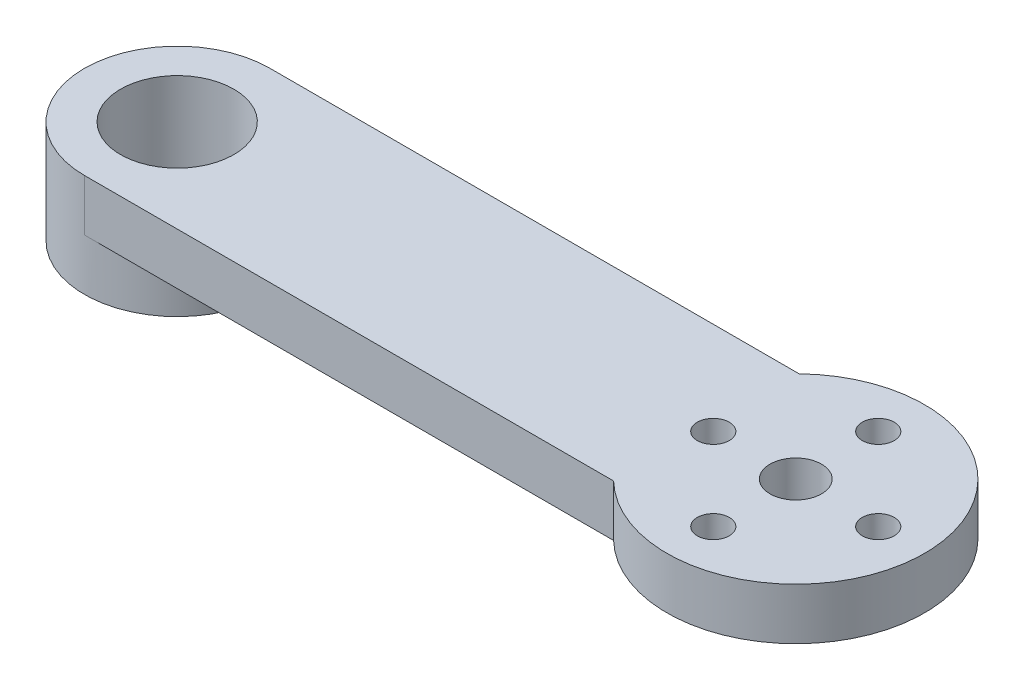
ISO-10303-21;
HEADER;
FILE_DESCRIPTION(('STEP AP214'),'2;1');
FILE_NAME('part.step','',(''),(''),'','','');
FILE_SCHEMA(('AUTOMOTIVE_DESIGN { 1 0 10303 214 1 1 1 1 }'));
ENDSEC;
DATA;
#1=APPLICATION_CONTEXT('core data for automotive mechanical design processes');
#2=APPLICATION_PROTOCOL_DEFINITION('international standard','automotive_design',2000,#1);
#3=PRODUCT_CONTEXT('',#1,'mechanical');
#4=PRODUCT('Part','Part','',(#3));
#5=PRODUCT_RELATED_PRODUCT_CATEGORY('part','',(#4));
#6=PRODUCT_DEFINITION_FORMATION('','',#4);
#7=PRODUCT_DEFINITION_CONTEXT('part definition',#1,'design');
#8=PRODUCT_DEFINITION('design','',#6,#7);
#9=PRODUCT_DEFINITION_SHAPE('','',#8);
#10=(LENGTH_UNIT() NAMED_UNIT(*) SI_UNIT(.MILLI.,.METRE.));
#11=(NAMED_UNIT(*) PLANE_ANGLE_UNIT() SI_UNIT($,.RADIAN.));
#12=(NAMED_UNIT(*) SI_UNIT($,.STERADIAN.) SOLID_ANGLE_UNIT());
#13=UNCERTAINTY_MEASURE_WITH_UNIT(LENGTH_MEASURE(1.E-05),#10,'distance_accuracy_value','');
#14=(GEOMETRIC_REPRESENTATION_CONTEXT(3) GLOBAL_UNCERTAINTY_ASSIGNED_CONTEXT((#13)) GLOBAL_UNIT_ASSIGNED_CONTEXT((#10,
#11,#12)) REPRESENTATION_CONTEXT('',''));
#15=CARTESIAN_POINT('',(0.,0.,0.));
#16=DIRECTION('',(0.,0.,1.));
#17=DIRECTION('',(1.,0.,0.));
#18=AXIS2_PLACEMENT_3D('',#15,#16,#17);
#19=CARTESIAN_POINT('',(60.,0.,0.));
#20=DIRECTION('',(0.,1.,0.));
#21=DIRECTION('',(0.,0.,1.));
#22=AXIS2_PLACEMENT_3D('',#19,#20,#21);
#23=PLANE('',#22);
#24=CARTESIAN_POINT('',(60.,0.,8.));
#25=DIRECTION('',(0.,-1.,0.));
#26=DIRECTION('',(0.,0.,-1.));
#27=AXIS2_PLACEMENT_3D('',#24,#25,#26);
#28=CIRCLE('',#27,1.55);
#29=CARTESIAN_POINT('',(60.,0.,6.45));
#30=VERTEX_POINT('',#29);
#31=EDGE_CURVE('E174',#30,#30,#28,.T.);
#32=ORIENTED_EDGE('',*,*,#31,.F.);
#33=EDGE_LOOP('',(#32));
#34=FACE_BOUND('',#33,.T.);
#35=CARTESIAN_POINT('',(60.,0.,-8.));
#36=DIRECTION('',(0.,-1.,0.));
#37=DIRECTION('',(0.,0.,-1.));
#38=AXIS2_PLACEMENT_3D('',#35,#36,#37);
#39=CIRCLE('',#38,1.55);
#40=CARTESIAN_POINT('',(60.,0.,-9.55));
#41=VERTEX_POINT('',#40);
#42=EDGE_CURVE('E170',#41,#41,#39,.T.);
#43=ORIENTED_EDGE('',*,*,#42,.F.);
#44=EDGE_LOOP('',(#43));
#45=FACE_BOUND('',#44,.T.);
#46=CARTESIAN_POINT('',(68.,0.,0.));
#47=DIRECTION('',(0.,-1.,0.));
#48=DIRECTION('',(0.,0.,-1.));
#49=AXIS2_PLACEMENT_3D('',#46,#47,#48);
#50=CIRCLE('',#49,1.54999999999999);
#51=CARTESIAN_POINT('',(68.,0.,-1.54999999999999));
#52=VERTEX_POINT('',#51);
#53=EDGE_CURVE('E162',#52,#52,#50,.T.);
#54=ORIENTED_EDGE('',*,*,#53,.F.);
#55=EDGE_LOOP('',(#54));
#56=FACE_BOUND('',#55,.T.);
#57=CARTESIAN_POINT('',(52.,0.,0.));
#58=DIRECTION('',(0.,-1.,0.));
#59=DIRECTION('',(0.,0.,-1.));
#60=AXIS2_PLACEMENT_3D('',#57,#58,#59);
#61=CIRCLE('',#60,1.55);
#62=CARTESIAN_POINT('',(52.,0.,-1.55));
#63=VERTEX_POINT('',#62);
#64=EDGE_CURVE('E154',#63,#63,#61,.T.);
#65=ORIENTED_EDGE('',*,*,#64,.F.);
#66=EDGE_LOOP('',(#65));
#67=FACE_BOUND('',#66,.T.);
#68=CARTESIAN_POINT('',(60.,0.,0.));
#69=DIRECTION('',(0.,1.,0.));
#70=DIRECTION('',(0.,0.,1.));
#71=AXIS2_PLACEMENT_3D('',#68,#69,#70);
#72=CIRCLE('',#71,2.50000000000002);
#73=CARTESIAN_POINT('',(60.,0.,2.50000000000002));
#74=VERTEX_POINT('',#73);
#75=EDGE_CURVE('E123',#74,#74,#72,.T.);
#76=ORIENTED_EDGE('',*,*,#75,.T.);
#77=EDGE_LOOP('',(#76));
#78=FACE_BOUND('',#77,.T.);
#79=CARTESIAN_POINT('',(0.,0.,0.));
#80=DIRECTION('',(0.,-1.,0.));
#81=DIRECTION('',(0.,0.,-1.));
#82=AXIS2_PLACEMENT_3D('',#79,#80,#81);
#83=CIRCLE('',#82,9.);
#84=CARTESIAN_POINT('',(0.,0.,-9.));
#85=VERTEX_POINT('',#84);
#86=CARTESIAN_POINT('',(0.,0.,9.));
#87=VERTEX_POINT('',#86);
#88=EDGE_CURVE('E77',#85,#87,#83,.T.);
#89=ORIENTED_EDGE('',*,*,#88,.F.);
#90=DIRECTION('',(-1.,0.,0.));
#91=VECTOR('',#90,1.);
#92=CARTESIAN_POINT('',(0.,0.,-9.));
#93=LINE('',#92,#91);
#94=CARTESIAN_POINT('',(51.3253242135513,0.,-9.));
#95=VERTEX_POINT('',#94);
#96=EDGE_CURVE('E95',#95,#85,#93,.T.);
#97=ORIENTED_EDGE('',*,*,#96,.F.);
#98=CARTESIAN_POINT('',(60.,0.,0.));
#99=DIRECTION('',(0.,1.,0.));
#100=DIRECTION('',(0.,0.,1.));
#101=AXIS2_PLACEMENT_3D('',#98,#99,#100);
#102=CIRCLE('',#101,12.5);
#103=CARTESIAN_POINT('',(51.3253242135513,0.,9.));
#104=VERTEX_POINT('',#103);
#105=EDGE_CURVE('E105',#104,#95,#102,.T.);
#106=ORIENTED_EDGE('',*,*,#105,.F.);
#107=DIRECTION('',(1.,0.,0.));
#108=VECTOR('',#107,1.);
#109=CARTESIAN_POINT('',(0.,0.,9.));
#110=LINE('',#109,#108);
#111=EDGE_CURVE('E83',#87,#104,#110,.T.);
#112=ORIENTED_EDGE('',*,*,#111,.F.);
#113=EDGE_LOOP('',(#89,#97,#106,#112));
#114=FACE_BOUND('',#113,.T.);
#115=ADVANCED_FACE('F44',(#34,#45,#56,#67,#78,#114),#23,.F.);
#116=CARTESIAN_POINT('',(60.,5.,0.));
#117=DIRECTION('',(0.,-1.,0.));
#118=DIRECTION('',(0.,0.,-1.));
#119=AXIS2_PLACEMENT_3D('',#116,#117,#118);
#120=CYLINDRICAL_SURFACE('',#119,12.5);
#121=ORIENTED_EDGE('',*,*,#105,.T.);
#122=DIRECTION('',(0.,-1.,0.));
#123=VECTOR('',#122,1.);
#124=CARTESIAN_POINT('',(51.3253242135513,5.,-9.));
#125=LINE('',#124,#123);
#126=CARTESIAN_POINT('',(51.3253242135513,5.,-9.));
#127=VERTEX_POINT('',#126);
#128=EDGE_CURVE('E11',#127,#95,#125,.T.);
#129=ORIENTED_EDGE('',*,*,#128,.F.);
#130=CARTESIAN_POINT('',(60.,5.,0.));
#131=DIRECTION('',(0.,1.,0.));
#132=DIRECTION('',(0.,0.,1.));
#133=AXIS2_PLACEMENT_3D('',#130,#131,#132);
#134=CIRCLE('',#133,12.5);
#135=CARTESIAN_POINT('',(51.3253242135513,5.,9.));
#136=VERTEX_POINT('',#135);
#137=EDGE_CURVE('E119',#136,#127,#134,.T.);
#138=ORIENTED_EDGE('',*,*,#137,.F.);
#139=DIRECTION('',(0.,-1.,0.));
#140=VECTOR('',#139,1.);
#141=CARTESIAN_POINT('',(51.3253242135513,5.,9.));
#142=LINE('',#141,#140);
#143=EDGE_CURVE('E113',#136,#104,#142,.T.);
#144=ORIENTED_EDGE('',*,*,#143,.T.);
#145=EDGE_LOOP('',(#121,#129,#138,#144));
#146=FACE_BOUND('',#145,.T.);
#147=ADVANCED_FACE('F46',(#146),#120,.T.);
#148=CARTESIAN_POINT('',(0.,5.,-9.));
#149=DIRECTION('',(0.,0.,1.));
#150=DIRECTION('',(1.,0.,0.));
#151=AXIS2_PLACEMENT_3D('',#148,#149,#150);
#152=PLANE('',#151);
#153=ORIENTED_EDGE('',*,*,#96,.T.);
#154=DIRECTION('',(0.,-1.,0.));
#155=VECTOR('',#154,1.);
#156=CARTESIAN_POINT('',(0.,5.,-9.));
#157=LINE('',#156,#155);
#158=CARTESIAN_POINT('',(0.,5.,-9.));
#159=VERTEX_POINT('',#158);
#160=EDGE_CURVE('E54',#159,#85,#157,.T.);
#161=ORIENTED_EDGE('',*,*,#160,.F.);
#162=DIRECTION('',(-1.,0.,0.));
#163=VECTOR('',#162,1.);
#164=CARTESIAN_POINT('',(0.,5.,-9.));
#165=LINE('',#164,#163);
#166=EDGE_CURVE('E90',#127,#159,#165,.T.);
#167=ORIENTED_EDGE('',*,*,#166,.F.);
#168=ORIENTED_EDGE('',*,*,#128,.T.);
#169=EDGE_LOOP('',(#153,#161,#167,#168));
#170=FACE_BOUND('',#169,.T.);
#171=ADVANCED_FACE('F100',(#170),#152,.F.);
#172=CARTESIAN_POINT('',(0.,5.,0.));
#173=DIRECTION('',(0.,-1.,0.));
#174=DIRECTION('',(0.,0.,-1.));
#175=AXIS2_PLACEMENT_3D('',#172,#173,#174);
#176=CYLINDRICAL_SURFACE('',#175,9.);
#177=ORIENTED_EDGE('',*,*,#160,.T.);
#178=ORIENTED_EDGE('',*,*,#88,.T.);
#179=DIRECTION('',(0.,-1.,0.));
#180=VECTOR('',#179,1.);
#181=CARTESIAN_POINT('',(0.,5.,9.));
#182=LINE('',#181,#180);
#183=CARTESIAN_POINT('',(0.,5.,9.));
#184=VERTEX_POINT('',#183);
#185=EDGE_CURVE('E111',#184,#87,#182,.T.);
#186=ORIENTED_EDGE('',*,*,#185,.F.);
#187=CARTESIAN_POINT('',(0.,5.,0.));
#188=DIRECTION('',(0.,1.,0.));
#189=DIRECTION('',(0.,0.,1.));
#190=AXIS2_PLACEMENT_3D('',#187,#188,#189);
#191=CIRCLE('',#190,9.);
#192=EDGE_CURVE('E109',#159,#184,#191,.T.);
#193=ORIENTED_EDGE('',*,*,#192,.F.);
#194=EDGE_LOOP('',(#177,#178,#186,#193));
#195=FACE_BOUND('',#194,.T.);
#196=CARTESIAN_POINT('',(0.,-5.,0.));
#197=DIRECTION('',(0.,-1.,0.));
#198=DIRECTION('',(0.,0.,-1.));
#199=AXIS2_PLACEMENT_3D('',#196,#197,#198);
#200=CIRCLE('',#199,9.);
#201=CARTESIAN_POINT('',(0.,-5.,-9.));
#202=VERTEX_POINT('',#201);
#203=EDGE_CURVE('E97',#202,#202,#200,.T.);
#204=ORIENTED_EDGE('',*,*,#203,.F.);
#205=EDGE_LOOP('',(#204));
#206=FACE_BOUND('',#205,.T.);
#207=ADVANCED_FACE('F107',(#195,#206),#176,.T.);
#208=CARTESIAN_POINT('',(0.,5.,9.));
#209=DIRECTION('',(0.,0.,-1.));
#210=DIRECTION('',(-1.,0.,0.));
#211=AXIS2_PLACEMENT_3D('',#208,#209,#210);
#212=PLANE('',#211);
#213=ORIENTED_EDGE('',*,*,#111,.T.);
#214=ORIENTED_EDGE('',*,*,#143,.F.);
#215=DIRECTION('',(1.,0.,0.));
#216=VECTOR('',#215,1.);
#217=CARTESIAN_POINT('',(0.,5.,9.));
#218=LINE('',#217,#216);
#219=EDGE_CURVE('E62',#184,#136,#218,.T.);
#220=ORIENTED_EDGE('',*,*,#219,.F.);
#221=ORIENTED_EDGE('',*,*,#185,.T.);
#222=EDGE_LOOP('',(#213,#214,#220,#221));
#223=FACE_BOUND('',#222,.T.);
#224=ADVANCED_FACE('F211',(#223),#212,.F.);
#225=CARTESIAN_POINT('',(60.,5.,0.));
#226=DIRECTION('',(0.,1.,0.));
#227=DIRECTION('',(0.,0.,1.));
#228=AXIS2_PLACEMENT_3D('',#225,#226,#227);
#229=PLANE('',#228);
#230=CARTESIAN_POINT('',(60.,5.,8.));
#231=DIRECTION('',(0.,-1.,0.));
#232=DIRECTION('',(0.,0.,-1.));
#233=AXIS2_PLACEMENT_3D('',#230,#231,#232);
#234=CIRCLE('',#233,1.55);
#235=CARTESIAN_POINT('',(60.,5.,6.45));
#236=VERTEX_POINT('',#235);
#237=EDGE_CURVE('E146',#236,#236,#234,.T.);
#238=ORIENTED_EDGE('',*,*,#237,.T.);
#239=EDGE_LOOP('',(#238));
#240=FACE_BOUND('',#239,.T.);
#241=CARTESIAN_POINT('',(60.,5.,-8.));
#242=DIRECTION('',(0.,-1.,0.));
#243=DIRECTION('',(0.,0.,-1.));
#244=AXIS2_PLACEMENT_3D('',#241,#242,#243);
#245=CIRCLE('',#244,1.55);
#246=CARTESIAN_POINT('',(60.,5.,-9.55));
#247=VERTEX_POINT('',#246);
#248=EDGE_CURVE('E166',#247,#247,#245,.T.);
#249=ORIENTED_EDGE('',*,*,#248,.T.);
#250=EDGE_LOOP('',(#249));
#251=FACE_BOUND('',#250,.T.);
#252=CARTESIAN_POINT('',(68.,5.,0.));
#253=DIRECTION('',(0.,-1.,0.));
#254=DIRECTION('',(0.,0.,-1.));
#255=AXIS2_PLACEMENT_3D('',#252,#253,#254);
#256=CIRCLE('',#255,1.54999999999999);
#257=CARTESIAN_POINT('',(68.,5.,-1.54999999999999));
#258=VERTEX_POINT('',#257);
#259=EDGE_CURVE('E158',#258,#258,#256,.T.);
#260=ORIENTED_EDGE('',*,*,#259,.T.);
#261=EDGE_LOOP('',(#260));
#262=FACE_BOUND('',#261,.T.);
#263=CARTESIAN_POINT('',(52.,5.,0.));
#264=DIRECTION('',(0.,-1.,0.));
#265=DIRECTION('',(0.,0.,-1.));
#266=AXIS2_PLACEMENT_3D('',#263,#264,#265);
#267=CIRCLE('',#266,1.55);
#268=CARTESIAN_POINT('',(52.,5.,-1.55));
#269=VERTEX_POINT('',#268);
#270=EDGE_CURVE('E150',#269,#269,#267,.T.);
#271=ORIENTED_EDGE('',*,*,#270,.T.);
#272=EDGE_LOOP('',(#271));
#273=FACE_BOUND('',#272,.T.);
#274=CARTESIAN_POINT('',(0.,5.,0.));
#275=DIRECTION('',(0.,-1.,0.));
#276=DIRECTION('',(0.,0.,-1.));
#277=AXIS2_PLACEMENT_3D('',#274,#275,#276);
#278=CIRCLE('',#277,5.5);
#279=CARTESIAN_POINT('',(0.,5.,-5.5));
#280=VERTEX_POINT('',#279);
#281=EDGE_CURVE('E98',#280,#280,#278,.T.);
#282=ORIENTED_EDGE('',*,*,#281,.T.);
#283=EDGE_LOOP('',(#282));
#284=FACE_BOUND('',#283,.T.);
#285=CARTESIAN_POINT('',(60.,5.,0.));
#286=DIRECTION('',(0.,1.,0.));
#287=DIRECTION('',(0.,0.,1.));
#288=AXIS2_PLACEMENT_3D('',#285,#286,#287);
#289=CIRCLE('',#288,2.50000000000002);
#290=CARTESIAN_POINT('',(60.,5.,2.50000000000002));
#291=VERTEX_POINT('',#290);
#292=EDGE_CURVE('E132',#291,#291,#289,.T.);
#293=ORIENTED_EDGE('',*,*,#292,.F.);
#294=EDGE_LOOP('',(#293));
#295=FACE_BOUND('',#294,.T.);
#296=ORIENTED_EDGE('',*,*,#137,.T.);
#297=ORIENTED_EDGE('',*,*,#166,.T.);
#298=ORIENTED_EDGE('',*,*,#192,.T.);
#299=ORIENTED_EDGE('',*,*,#219,.T.);
#300=EDGE_LOOP('',(#296,#297,#298,#299));
#301=FACE_BOUND('',#300,.T.);
#302=ADVANCED_FACE('F182',(#240,#251,#262,#273,#284,#295,#301),#229,.T.);
#303=CARTESIAN_POINT('',(60.,0.,0.));
#304=DIRECTION('',(0.,1.,0.));
#305=DIRECTION('',(0.,0.,1.));
#306=AXIS2_PLACEMENT_3D('',#303,#304,#305);
#307=CYLINDRICAL_SURFACE('',#306,2.50000000000002);
#308=ORIENTED_EDGE('',*,*,#75,.F.);
#309=EDGE_LOOP('',(#308));
#310=FACE_BOUND('',#309,.T.);
#311=ORIENTED_EDGE('',*,*,#292,.T.);
#312=EDGE_LOOP('',(#311));
#313=FACE_BOUND('',#312,.T.);
#314=ADVANCED_FACE('F203',(#310,#313),#307,.F.);
#315=CARTESIAN_POINT('',(0.,-5.,0.));
#316=DIRECTION('',(0.,-1.,0.));
#317=DIRECTION('',(0.,0.,-1.));
#318=AXIS2_PLACEMENT_3D('',#315,#316,#317);
#319=PLANE('',#318);
#320=CARTESIAN_POINT('',(0.,-5.,0.));
#321=DIRECTION('',(0.,-1.,0.));
#322=DIRECTION('',(0.,0.,-1.));
#323=AXIS2_PLACEMENT_3D('',#320,#321,#322);
#324=CIRCLE('',#323,5.5);
#325=CARTESIAN_POINT('',(0.,-5.,-5.5));
#326=VERTEX_POINT('',#325);
#327=EDGE_CURVE('E142',#326,#326,#324,.T.);
#328=ORIENTED_EDGE('',*,*,#327,.F.);
#329=EDGE_LOOP('',(#328));
#330=FACE_BOUND('',#329,.T.);
#331=ORIENTED_EDGE('',*,*,#203,.T.);
#332=EDGE_LOOP('',(#331));
#333=FACE_BOUND('',#332,.T.);
#334=ADVANCED_FACE('F206',(#330,#333),#319,.T.);
#335=CARTESIAN_POINT('',(0.,5.,0.));
#336=DIRECTION('',(0.,-1.,0.));
#337=DIRECTION('',(0.,0.,-1.));
#338=AXIS2_PLACEMENT_3D('',#335,#336,#337);
#339=CYLINDRICAL_SURFACE('',#338,5.5);
#340=ORIENTED_EDGE('',*,*,#281,.F.);
#341=EDGE_LOOP('',(#340));
#342=FACE_BOUND('',#341,.T.);
#343=ORIENTED_EDGE('',*,*,#327,.T.);
#344=EDGE_LOOP('',(#343));
#345=FACE_BOUND('',#344,.T.);
#346=ADVANCED_FACE('F259',(#342,#345),#339,.F.);
#347=CARTESIAN_POINT('',(52.,5.,0.));
#348=DIRECTION('',(0.,-1.,0.));
#349=DIRECTION('',(0.,0.,-1.));
#350=AXIS2_PLACEMENT_3D('',#347,#348,#349);
#351=CYLINDRICAL_SURFACE('',#350,1.55);
#352=ORIENTED_EDGE('',*,*,#270,.F.);
#353=EDGE_LOOP('',(#352));
#354=FACE_BOUND('',#353,.T.);
#355=ORIENTED_EDGE('',*,*,#64,.T.);
#356=EDGE_LOOP('',(#355));
#357=FACE_BOUND('',#356,.T.);
#358=ADVANCED_FACE('F269',(#354,#357),#351,.F.);
#359=CARTESIAN_POINT('',(68.,5.,0.));
#360=DIRECTION('',(0.,-1.,0.));
#361=DIRECTION('',(0.,0.,-1.));
#362=AXIS2_PLACEMENT_3D('',#359,#360,#361);
#363=CYLINDRICAL_SURFACE('',#362,1.54999999999999);
#364=ORIENTED_EDGE('',*,*,#259,.F.);
#365=EDGE_LOOP('',(#364));
#366=FACE_BOUND('',#365,.T.);
#367=ORIENTED_EDGE('',*,*,#53,.T.);
#368=EDGE_LOOP('',(#367));
#369=FACE_BOUND('',#368,.T.);
#370=ADVANCED_FACE('F279',(#366,#369),#363,.F.);
#371=CARTESIAN_POINT('',(60.,5.,-8.));
#372=DIRECTION('',(0.,-1.,0.));
#373=DIRECTION('',(0.,0.,-1.));
#374=AXIS2_PLACEMENT_3D('',#371,#372,#373);
#375=CYLINDRICAL_SURFACE('',#374,1.55);
#376=ORIENTED_EDGE('',*,*,#248,.F.);
#377=EDGE_LOOP('',(#376));
#378=FACE_BOUND('',#377,.T.);
#379=ORIENTED_EDGE('',*,*,#42,.T.);
#380=EDGE_LOOP('',(#379));
#381=FACE_BOUND('',#380,.T.);
#382=ADVANCED_FACE('F188',(#378,#381),#375,.F.);
#383=CARTESIAN_POINT('',(60.,5.,8.));
#384=DIRECTION('',(0.,-1.,0.));
#385=DIRECTION('',(0.,0.,-1.));
#386=AXIS2_PLACEMENT_3D('',#383,#384,#385);
#387=CYLINDRICAL_SURFACE('',#386,1.55);
#388=ORIENTED_EDGE('',*,*,#237,.F.);
#389=EDGE_LOOP('',(#388));
#390=FACE_BOUND('',#389,.T.);
#391=ORIENTED_EDGE('',*,*,#31,.T.);
#392=EDGE_LOOP('',(#391));
#393=FACE_BOUND('',#392,.T.);
#394=ADVANCED_FACE('F185',(#390,#393),#387,.F.);
#395=CLOSED_SHELL('',(#115,#147,#171,#207,#224,#302,#314,#334,#346,#358,#370,#382,#394));
#396=MANIFOLD_SOLID_BREP('B2',#395);
#397=ADVANCED_BREP_SHAPE_REPRESENTATION('',(#18,#396),#14);
#398=SHAPE_DEFINITION_REPRESENTATION(#9,#397);
ENDSEC;
END-ISO-10303-21;
